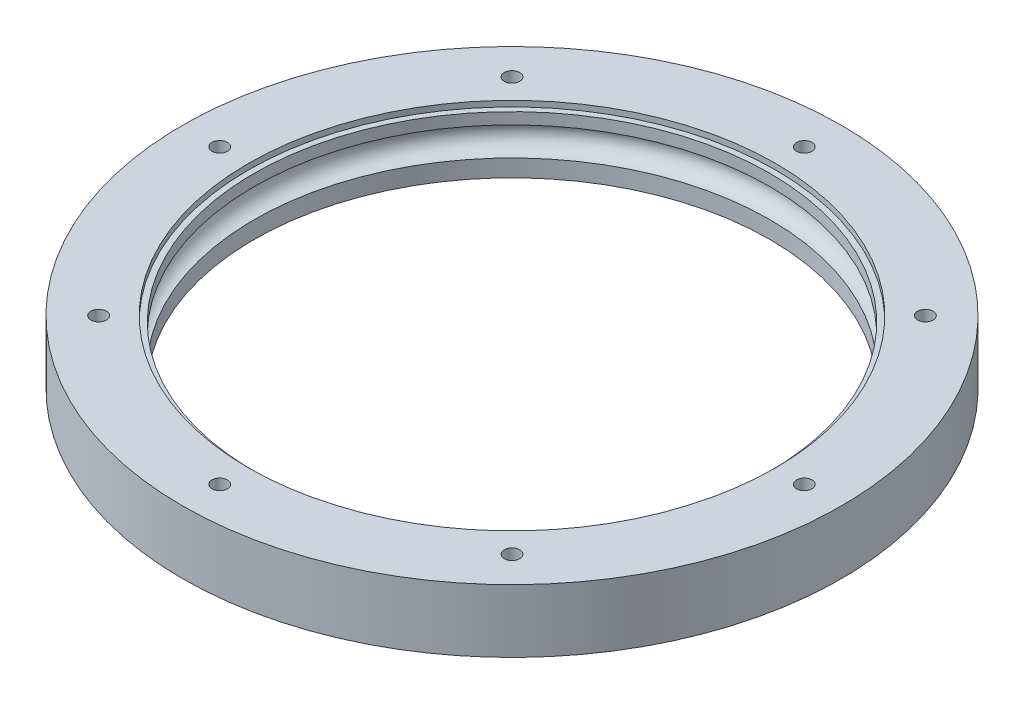
ISO-10303-21;
HEADER;
FILE_DESCRIPTION(('STEP AP214'),'2;1');
FILE_NAME('part.step','',(''),(''),'','','');
FILE_SCHEMA(('AUTOMOTIVE_DESIGN { 1 0 10303 214 1 1 1 1 }'));
ENDSEC;
DATA;
#1=APPLICATION_CONTEXT('core data for automotive mechanical design processes');
#2=APPLICATION_PROTOCOL_DEFINITION('international standard','automotive_design',2000,#1);
#3=PRODUCT_CONTEXT('',#1,'mechanical');
#4=PRODUCT('Part','Part','',(#3));
#5=PRODUCT_RELATED_PRODUCT_CATEGORY('part','',(#4));
#6=PRODUCT_DEFINITION_FORMATION('','',#4);
#7=PRODUCT_DEFINITION_CONTEXT('part definition',#1,'design');
#8=PRODUCT_DEFINITION('design','',#6,#7);
#9=PRODUCT_DEFINITION_SHAPE('','',#8);
#10=(LENGTH_UNIT() NAMED_UNIT(*) SI_UNIT(.MILLI.,.METRE.));
#11=(NAMED_UNIT(*) PLANE_ANGLE_UNIT() SI_UNIT($,.RADIAN.));
#12=(NAMED_UNIT(*) SI_UNIT($,.STERADIAN.) SOLID_ANGLE_UNIT());
#13=UNCERTAINTY_MEASURE_WITH_UNIT(LENGTH_MEASURE(1.E-05),#10,'distance_accuracy_value','');
#14=(GEOMETRIC_REPRESENTATION_CONTEXT(3) GLOBAL_UNCERTAINTY_ASSIGNED_CONTEXT((#13)) GLOBAL_UNIT_ASSIGNED_CONTEXT((#10,
#11,#12)) REPRESENTATION_CONTEXT('',''));
#15=CARTESIAN_POINT('',(0.,0.,0.));
#16=DIRECTION('',(0.,0.,1.));
#17=DIRECTION('',(1.,0.,0.));
#18=AXIS2_PLACEMENT_3D('',#15,#16,#17);
#19=CARTESIAN_POINT('',(0.,0.,0.));
#20=DIRECTION('',(0.,-1.,0.));
#21=DIRECTION('',(0.,0.,-1.));
#22=AXIS2_PLACEMENT_3D('',#19,#20,#21);
#23=CYLINDRICAL_SURFACE('',#22,57.5);
#24=CARTESIAN_POINT('',(0.,11.,0.));
#25=DIRECTION('',(0.,-1.,0.));
#26=DIRECTION('',(0.,0.,-1.));
#27=AXIS2_PLACEMENT_3D('',#24,#25,#26);
#28=CIRCLE('',#27,57.5);
#29=CARTESIAN_POINT('',(0.,11.,-57.5));
#30=VERTEX_POINT('',#29);
#31=EDGE_CURVE('E61',#30,#30,#28,.T.);
#32=ORIENTED_EDGE('',*,*,#31,.T.);
#33=EDGE_LOOP('',(#32));
#34=FACE_BOUND('',#33,.T.);
#35=CARTESIAN_POINT('',(0.,0.,0.));
#36=DIRECTION('',(0.,-1.,0.));
#37=DIRECTION('',(0.,0.,-1.));
#38=AXIS2_PLACEMENT_3D('',#35,#36,#37);
#39=CIRCLE('',#38,57.5);
#40=CARTESIAN_POINT('',(0.,0.,-57.5));
#41=VERTEX_POINT('',#40);
#42=EDGE_CURVE('E10',#41,#41,#39,.T.);
#43=ORIENTED_EDGE('',*,*,#42,.F.);
#44=EDGE_LOOP('',(#43));
#45=FACE_BOUND('',#44,.T.);
#46=ADVANCED_FACE('F33',(#34,#45),#23,.T.);
#47=CARTESIAN_POINT('',(0.,0.,0.));
#48=DIRECTION('',(0.,1.,0.));
#49=DIRECTION('',(0.,0.,1.));
#50=AXIS2_PLACEMENT_3D('',#47,#48,#49);
#51=PLANE('',#50);
#52=CARTESIAN_POINT('',(0.,0.,51.));
#53=DIRECTION('',(0.,1.,0.));
#54=DIRECTION('',(0.,0.,1.));
#55=AXIS2_PLACEMENT_3D('',#52,#53,#54);
#56=CIRCLE('',#55,1.35000000000001);
#57=CARTESIAN_POINT('',(0.,0.,52.35));
#58=VERTEX_POINT('',#57);
#59=EDGE_CURVE('E68',#58,#58,#56,.T.);
#60=ORIENTED_EDGE('',*,*,#59,.T.);
#61=EDGE_LOOP('',(#60));
#62=FACE_BOUND('',#61,.T.);
#63=CARTESIAN_POINT('',(36.0624458405139,0.,36.062445840514));
#64=DIRECTION('',(0.,1.,0.));
#65=DIRECTION('',(0.,0.,1.));
#66=AXIS2_PLACEMENT_3D('',#63,#64,#65);
#67=CIRCLE('',#66,1.35);
#68=CARTESIAN_POINT('',(36.0624458405139,0.,37.412445840514));
#69=VERTEX_POINT('',#68);
#70=EDGE_CURVE('E87',#69,#69,#67,.T.);
#71=ORIENTED_EDGE('',*,*,#70,.T.);
#72=EDGE_LOOP('',(#71));
#73=FACE_BOUND('',#72,.T.);
#74=CARTESIAN_POINT('',(51.,0.,0.));
#75=DIRECTION('',(0.,1.,0.));
#76=DIRECTION('',(0.,0.,1.));
#77=AXIS2_PLACEMENT_3D('',#74,#75,#76);
#78=CIRCLE('',#77,1.34999999999999);
#79=CARTESIAN_POINT('',(51.,0.,1.35000000000006));
#80=VERTEX_POINT('',#79);
#81=EDGE_CURVE('E81',#80,#80,#78,.T.);
#82=ORIENTED_EDGE('',*,*,#81,.T.);
#83=EDGE_LOOP('',(#82));
#84=FACE_BOUND('',#83,.T.);
#85=CARTESIAN_POINT('',(36.062445840514,0.,-36.0624458405139));
#86=DIRECTION('',(0.,1.,0.));
#87=DIRECTION('',(0.,0.,1.));
#88=AXIS2_PLACEMENT_3D('',#85,#86,#87);
#89=CIRCLE('',#88,1.35);
#90=CARTESIAN_POINT('',(36.062445840514,0.,-34.7124458405139));
#91=VERTEX_POINT('',#90);
#92=EDGE_CURVE('E74',#91,#91,#89,.T.);
#93=ORIENTED_EDGE('',*,*,#92,.T.);
#94=EDGE_LOOP('',(#93));
#95=FACE_BOUND('',#94,.T.);
#96=CARTESIAN_POINT('',(0.,0.,-51.));
#97=DIRECTION('',(0.,1.,0.));
#98=DIRECTION('',(0.,0.,1.));
#99=AXIS2_PLACEMENT_3D('',#96,#97,#98);
#100=CIRCLE('',#99,1.35);
#101=CARTESIAN_POINT('',(0.,0.,-49.65));
#102=VERTEX_POINT('',#101);
#103=EDGE_CURVE('E75',#102,#102,#100,.T.);
#104=ORIENTED_EDGE('',*,*,#103,.T.);
#105=EDGE_LOOP('',(#104));
#106=FACE_BOUND('',#105,.T.);
#107=CARTESIAN_POINT('',(-36.0624458405139,0.,-36.062445840514));
#108=DIRECTION('',(0.,1.,0.));
#109=DIRECTION('',(0.,0.,1.));
#110=AXIS2_PLACEMENT_3D('',#107,#108,#109);
#111=CIRCLE('',#110,1.35);
#112=CARTESIAN_POINT('',(-36.0624458405139,0.,-34.712445840514));
#113=VERTEX_POINT('',#112);
#114=EDGE_CURVE('E104',#113,#113,#111,.T.);
#115=ORIENTED_EDGE('',*,*,#114,.T.);
#116=EDGE_LOOP('',(#115));
#117=FACE_BOUND('',#116,.T.);
#118=CARTESIAN_POINT('',(-51.,0.,0.));
#119=DIRECTION('',(0.,1.,0.));
#120=DIRECTION('',(0.,0.,1.));
#121=AXIS2_PLACEMENT_3D('',#118,#119,#120);
#122=CIRCLE('',#121,1.35000000000001);
#123=CARTESIAN_POINT('',(-51.,0.,1.34999999999994));
#124=VERTEX_POINT('',#123);
#125=EDGE_CURVE('E98',#124,#124,#122,.T.);
#126=ORIENTED_EDGE('',*,*,#125,.T.);
#127=EDGE_LOOP('',(#126));
#128=FACE_BOUND('',#127,.T.);
#129=CARTESIAN_POINT('',(-36.062445840514,0.,36.0624458405139));
#130=DIRECTION('',(0.,1.,0.));
#131=DIRECTION('',(0.,0.,1.));
#132=AXIS2_PLACEMENT_3D('',#129,#130,#131);
#133=CIRCLE('',#132,1.35000000000001);
#134=CARTESIAN_POINT('',(-36.062445840514,0.,37.4124458405139));
#135=VERTEX_POINT('',#134);
#136=EDGE_CURVE('E64',#135,#135,#133,.T.);
#137=ORIENTED_EDGE('',*,*,#136,.T.);
#138=EDGE_LOOP('',(#137));
#139=FACE_BOUND('',#138,.T.);
#140=CARTESIAN_POINT('',(0.,0.,0.));
#141=DIRECTION('',(0.,-1.,0.));
#142=DIRECTION('',(0.,0.,-1.));
#143=AXIS2_PLACEMENT_3D('',#140,#141,#142);
#144=CIRCLE('',#143,45.);
#145=CARTESIAN_POINT('',(0.,0.,-45.));
#146=VERTEX_POINT('',#145);
#147=EDGE_CURVE('E39',#146,#146,#144,.T.);
#148=ORIENTED_EDGE('',*,*,#147,.F.);
#149=EDGE_LOOP('',(#148));
#150=FACE_BOUND('',#149,.T.);
#151=ORIENTED_EDGE('',*,*,#42,.T.);
#152=EDGE_LOOP('',(#151));
#153=FACE_BOUND('',#152,.T.);
#154=ADVANCED_FACE('F113',(#62,#73,#84,#95,#106,#117,#128,#139,#150,#153),#51,.F.);
#155=CARTESIAN_POINT('',(0.,0.,0.));
#156=DIRECTION('',(0.,-1.,0.));
#157=DIRECTION('',(0.,0.,-1.));
#158=AXIS2_PLACEMENT_3D('',#155,#156,#157);
#159=CYLINDRICAL_SURFACE('',#158,45.);
#160=ORIENTED_EDGE('',*,*,#147,.T.);
#161=EDGE_LOOP('',(#160));
#162=FACE_BOUND('',#161,.T.);
#163=CARTESIAN_POINT('',(0.,2.99999999999999,0.));
#164=DIRECTION('',(0.,-1.,0.));
#165=DIRECTION('',(0.,0.,-1.));
#166=AXIS2_PLACEMENT_3D('',#163,#164,#165);
#167=CIRCLE('',#166,45.);
#168=CARTESIAN_POINT('',(0.,2.99999999999999,-45.));
#169=VERTEX_POINT('',#168);
#170=EDGE_CURVE('E43',#169,#169,#167,.T.);
#171=ORIENTED_EDGE('',*,*,#170,.F.);
#172=EDGE_LOOP('',(#171));
#173=FACE_BOUND('',#172,.T.);
#174=ADVANCED_FACE('F146',(#162,#173),#159,.F.);
#175=CARTESIAN_POINT('',(0.,5.49999999999999,0.));
#176=DIRECTION('',(0.,-1.,0.));
#177=DIRECTION('',(0.,0.,-1.));
#178=AXIS2_PLACEMENT_3D('',#175,#176,#177);
#179=TOROIDAL_SURFACE('',#178,45.,2.5);
#180=ORIENTED_EDGE('',*,*,#170,.T.);
#181=EDGE_LOOP('',(#180));
#182=FACE_BOUND('',#181,.T.);
#183=CARTESIAN_POINT('',(0.,7.99999999999999,0.));
#184=DIRECTION('',(0.,-1.,0.));
#185=DIRECTION('',(0.,0.,-1.));
#186=AXIS2_PLACEMENT_3D('',#183,#184,#185);
#187=CIRCLE('',#186,45.);
#188=CARTESIAN_POINT('',(0.,7.99999999999999,-45.));
#189=VERTEX_POINT('',#188);
#190=EDGE_CURVE('E47',#189,#189,#187,.T.);
#191=ORIENTED_EDGE('',*,*,#190,.F.);
#192=EDGE_LOOP('',(#191));
#193=FACE_BOUND('',#192,.T.);
#194=ADVANCED_FACE('F151',(#182,#193),#179,.F.);
#195=ORIENTED_EDGE('',*,*,#190,.T.);
#196=EDGE_LOOP('',(#195));
#197=FACE_BOUND('',#196,.T.);
#198=CARTESIAN_POINT('',(0.,9.99999999999999,0.));
#199=DIRECTION('',(0.,-1.,0.));
#200=DIRECTION('',(0.,0.,-1.));
#201=AXIS2_PLACEMENT_3D('',#198,#199,#200);
#202=CIRCLE('',#201,45.);
#203=CARTESIAN_POINT('',(0.,9.99999999999999,-45.));
#204=VERTEX_POINT('',#203);
#205=EDGE_CURVE('E52',#204,#204,#202,.T.);
#206=ORIENTED_EDGE('',*,*,#205,.F.);
#207=EDGE_LOOP('',(#206));
#208=FACE_BOUND('',#207,.T.);
#209=ADVANCED_FACE('F153',(#197,#208),#159,.F.);
#210=CARTESIAN_POINT('',(0.,9.99999999999999,0.));
#211=DIRECTION('',(0.,-1.,0.));
#212=DIRECTION('',(0.,0.,-1.));
#213=AXIS2_PLACEMENT_3D('',#210,#211,#212);
#214=PLANE('',#213);
#215=CARTESIAN_POINT('',(0.,9.99999999999999,0.));
#216=DIRECTION('',(0.,-1.,0.));
#217=DIRECTION('',(0.,0.,-1.));
#218=AXIS2_PLACEMENT_3D('',#215,#216,#217);
#219=CIRCLE('',#218,46.);
#220=CARTESIAN_POINT('',(0.,9.99999999999999,-46.));
#221=VERTEX_POINT('',#220);
#222=EDGE_CURVE('E55',#221,#221,#219,.T.);
#223=ORIENTED_EDGE('',*,*,#222,.F.);
#224=EDGE_LOOP('',(#223));
#225=FACE_BOUND('',#224,.T.);
#226=ORIENTED_EDGE('',*,*,#205,.T.);
#227=EDGE_LOOP('',(#226));
#228=FACE_BOUND('',#227,.T.);
#229=ADVANCED_FACE('F160',(#225,#228),#214,.F.);
#230=CARTESIAN_POINT('',(0.,0.,0.));
#231=DIRECTION('',(0.,-1.,0.));
#232=DIRECTION('',(0.,0.,-1.));
#233=AXIS2_PLACEMENT_3D('',#230,#231,#232);
#234=CYLINDRICAL_SURFACE('',#233,46.);
#235=CARTESIAN_POINT('',(0.,11.,0.));
#236=DIRECTION('',(0.,-1.,0.));
#237=DIRECTION('',(0.,0.,-1.));
#238=AXIS2_PLACEMENT_3D('',#235,#236,#237);
#239=CIRCLE('',#238,46.);
#240=CARTESIAN_POINT('',(0.,11.,-46.));
#241=VERTEX_POINT('',#240);
#242=EDGE_CURVE('E58',#241,#241,#239,.T.);
#243=ORIENTED_EDGE('',*,*,#242,.F.);
#244=EDGE_LOOP('',(#243));
#245=FACE_BOUND('',#244,.T.);
#246=ORIENTED_EDGE('',*,*,#222,.T.);
#247=EDGE_LOOP('',(#246));
#248=FACE_BOUND('',#247,.T.);
#249=ADVANCED_FACE('F128',(#245,#248),#234,.F.);
#250=CARTESIAN_POINT('',(0.,11.,0.));
#251=DIRECTION('',(0.,1.,0.));
#252=DIRECTION('',(0.,0.,1.));
#253=AXIS2_PLACEMENT_3D('',#250,#251,#252);
#254=PLANE('',#253);
#255=CARTESIAN_POINT('',(0.,11.,51.));
#256=DIRECTION('',(0.,1.,0.));
#257=DIRECTION('',(0.,0.,1.));
#258=AXIS2_PLACEMENT_3D('',#255,#256,#257);
#259=CIRCLE('',#258,1.35000000000001);
#260=CARTESIAN_POINT('',(0.,11.,52.35));
#261=VERTEX_POINT('',#260);
#262=EDGE_CURVE('E90',#261,#261,#259,.T.);
#263=ORIENTED_EDGE('',*,*,#262,.F.);
#264=EDGE_LOOP('',(#263));
#265=FACE_BOUND('',#264,.T.);
#266=CARTESIAN_POINT('',(36.0624458405139,11.,36.062445840514));
#267=DIRECTION('',(0.,1.,0.));
#268=DIRECTION('',(0.,0.,1.));
#269=AXIS2_PLACEMENT_3D('',#266,#267,#268);
#270=CIRCLE('',#269,1.35);
#271=CARTESIAN_POINT('',(36.0624458405139,11.,37.412445840514));
#272=VERTEX_POINT('',#271);
#273=EDGE_CURVE('E84',#272,#272,#270,.T.);
#274=ORIENTED_EDGE('',*,*,#273,.F.);
#275=EDGE_LOOP('',(#274));
#276=FACE_BOUND('',#275,.T.);
#277=CARTESIAN_POINT('',(51.,11.,0.));
#278=DIRECTION('',(0.,1.,0.));
#279=DIRECTION('',(0.,0.,1.));
#280=AXIS2_PLACEMENT_3D('',#277,#278,#279);
#281=CIRCLE('',#280,1.34999999999999);
#282=CARTESIAN_POINT('',(51.,11.,1.35000000000006));
#283=VERTEX_POINT('',#282);
#284=EDGE_CURVE('E78',#283,#283,#281,.T.);
#285=ORIENTED_EDGE('',*,*,#284,.F.);
#286=EDGE_LOOP('',(#285));
#287=FACE_BOUND('',#286,.T.);
#288=CARTESIAN_POINT('',(36.062445840514,11.,-36.0624458405139));
#289=DIRECTION('',(0.,1.,0.));
#290=DIRECTION('',(0.,0.,1.));
#291=AXIS2_PLACEMENT_3D('',#288,#289,#290);
#292=CIRCLE('',#291,1.35);
#293=CARTESIAN_POINT('',(36.062445840514,11.,-34.7124458405139));
#294=VERTEX_POINT('',#293);
#295=EDGE_CURVE('E71',#294,#294,#292,.T.);
#296=ORIENTED_EDGE('',*,*,#295,.F.);
#297=EDGE_LOOP('',(#296));
#298=FACE_BOUND('',#297,.T.);
#299=CARTESIAN_POINT('',(0.,11.,-51.));
#300=DIRECTION('',(0.,1.,0.));
#301=DIRECTION('',(0.,0.,1.));
#302=AXIS2_PLACEMENT_3D('',#299,#300,#301);
#303=CIRCLE('',#302,1.35);
#304=CARTESIAN_POINT('',(0.,11.,-49.65));
#305=VERTEX_POINT('',#304);
#306=EDGE_CURVE('E107',#305,#305,#303,.T.);
#307=ORIENTED_EDGE('',*,*,#306,.F.);
#308=EDGE_LOOP('',(#307));
#309=FACE_BOUND('',#308,.T.);
#310=CARTESIAN_POINT('',(-36.0624458405139,11.,-36.062445840514));
#311=DIRECTION('',(0.,1.,0.));
#312=DIRECTION('',(0.,0.,1.));
#313=AXIS2_PLACEMENT_3D('',#310,#311,#312);
#314=CIRCLE('',#313,1.35);
#315=CARTESIAN_POINT('',(-36.0624458405139,11.,-34.712445840514));
#316=VERTEX_POINT('',#315);
#317=EDGE_CURVE('E101',#316,#316,#314,.T.);
#318=ORIENTED_EDGE('',*,*,#317,.F.);
#319=EDGE_LOOP('',(#318));
#320=FACE_BOUND('',#319,.T.);
#321=CARTESIAN_POINT('',(-51.,11.,0.));
#322=DIRECTION('',(0.,1.,0.));
#323=DIRECTION('',(0.,0.,1.));
#324=AXIS2_PLACEMENT_3D('',#321,#322,#323);
#325=CIRCLE('',#324,1.35000000000001);
#326=CARTESIAN_POINT('',(-51.,11.,1.34999999999994));
#327=VERTEX_POINT('',#326);
#328=EDGE_CURVE('E95',#327,#327,#325,.T.);
#329=ORIENTED_EDGE('',*,*,#328,.F.);
#330=EDGE_LOOP('',(#329));
#331=FACE_BOUND('',#330,.T.);
#332=CARTESIAN_POINT('',(-36.062445840514,11.,36.0624458405139));
#333=DIRECTION('',(0.,1.,0.));
#334=DIRECTION('',(0.,0.,1.));
#335=AXIS2_PLACEMENT_3D('',#332,#333,#334);
#336=CIRCLE('',#335,1.35000000000001);
#337=CARTESIAN_POINT('',(-36.062445840514,11.,37.4124458405139));
#338=VERTEX_POINT('',#337);
#339=EDGE_CURVE('E65',#338,#338,#336,.T.);
#340=ORIENTED_EDGE('',*,*,#339,.F.);
#341=EDGE_LOOP('',(#340));
#342=FACE_BOUND('',#341,.T.);
#343=ORIENTED_EDGE('',*,*,#242,.T.);
#344=EDGE_LOOP('',(#343));
#345=FACE_BOUND('',#344,.T.);
#346=ORIENTED_EDGE('',*,*,#31,.F.);
#347=EDGE_LOOP('',(#346));
#348=FACE_BOUND('',#347,.T.);
#349=ADVANCED_FACE('F124',(#265,#276,#287,#298,#309,#320,#331,#342,#345,#348),#254,.T.);
#350=CARTESIAN_POINT('',(-36.062445840514,0.,36.0624458405139));
#351=DIRECTION('',(0.,1.,0.));
#352=DIRECTION('',(0.,0.,1.));
#353=AXIS2_PLACEMENT_3D('',#350,#351,#352);
#354=CYLINDRICAL_SURFACE('',#353,1.35000000000001);
#355=ORIENTED_EDGE('',*,*,#136,.F.);
#356=EDGE_LOOP('',(#355));
#357=FACE_BOUND('',#356,.T.);
#358=ORIENTED_EDGE('',*,*,#339,.T.);
#359=EDGE_LOOP('',(#358));
#360=FACE_BOUND('',#359,.T.);
#361=ADVANCED_FACE('F127',(#357,#360),#354,.F.);
#362=CARTESIAN_POINT('',(-51.,0.,0.));
#363=DIRECTION('',(0.,1.,0.));
#364=DIRECTION('',(0.,0.,1.));
#365=AXIS2_PLACEMENT_3D('',#362,#363,#364);
#366=CYLINDRICAL_SURFACE('',#365,1.35000000000001);
#367=ORIENTED_EDGE('',*,*,#125,.F.);
#368=EDGE_LOOP('',(#367));
#369=FACE_BOUND('',#368,.T.);
#370=ORIENTED_EDGE('',*,*,#328,.T.);
#371=EDGE_LOOP('',(#370));
#372=FACE_BOUND('',#371,.T.);
#373=ADVANCED_FACE('F170',(#369,#372),#366,.F.);
#374=CARTESIAN_POINT('',(-36.0624458405139,0.,-36.062445840514));
#375=DIRECTION('',(0.,1.,0.));
#376=DIRECTION('',(0.,0.,1.));
#377=AXIS2_PLACEMENT_3D('',#374,#375,#376);
#378=CYLINDRICAL_SURFACE('',#377,1.35);
#379=ORIENTED_EDGE('',*,*,#114,.F.);
#380=EDGE_LOOP('',(#379));
#381=FACE_BOUND('',#380,.T.);
#382=ORIENTED_EDGE('',*,*,#317,.T.);
#383=EDGE_LOOP('',(#382));
#384=FACE_BOUND('',#383,.T.);
#385=ADVANCED_FACE('F120',(#381,#384),#378,.F.);
#386=CARTESIAN_POINT('',(0.,0.,-51.));
#387=DIRECTION('',(0.,1.,0.));
#388=DIRECTION('',(0.,0.,1.));
#389=AXIS2_PLACEMENT_3D('',#386,#387,#388);
#390=CYLINDRICAL_SURFACE('',#389,1.35);
#391=ORIENTED_EDGE('',*,*,#103,.F.);
#392=EDGE_LOOP('',(#391));
#393=FACE_BOUND('',#392,.T.);
#394=ORIENTED_EDGE('',*,*,#306,.T.);
#395=EDGE_LOOP('',(#394));
#396=FACE_BOUND('',#395,.T.);
#397=ADVANCED_FACE('F116',(#393,#396),#390,.F.);
#398=CARTESIAN_POINT('',(36.062445840514,0.,-36.0624458405139));
#399=DIRECTION('',(0.,1.,0.));
#400=DIRECTION('',(0.,0.,1.));
#401=AXIS2_PLACEMENT_3D('',#398,#399,#400);
#402=CYLINDRICAL_SURFACE('',#401,1.35);
#403=ORIENTED_EDGE('',*,*,#92,.F.);
#404=EDGE_LOOP('',(#403));
#405=FACE_BOUND('',#404,.T.);
#406=ORIENTED_EDGE('',*,*,#295,.T.);
#407=EDGE_LOOP('',(#406));
#408=FACE_BOUND('',#407,.T.);
#409=ADVANCED_FACE('F119',(#405,#408),#402,.F.);
#410=CARTESIAN_POINT('',(51.,0.,0.));
#411=DIRECTION('',(0.,1.,0.));
#412=DIRECTION('',(0.,0.,1.));
#413=AXIS2_PLACEMENT_3D('',#410,#411,#412);
#414=CYLINDRICAL_SURFACE('',#413,1.34999999999999);
#415=ORIENTED_EDGE('',*,*,#81,.F.);
#416=EDGE_LOOP('',(#415));
#417=FACE_BOUND('',#416,.T.);
#418=ORIENTED_EDGE('',*,*,#284,.T.);
#419=EDGE_LOOP('',(#418));
#420=FACE_BOUND('',#419,.T.);
#421=ADVANCED_FACE('F174',(#417,#420),#414,.F.);
#422=CARTESIAN_POINT('',(36.0624458405139,0.,36.062445840514));
#423=DIRECTION('',(0.,1.,0.));
#424=DIRECTION('',(0.,0.,1.));
#425=AXIS2_PLACEMENT_3D('',#422,#423,#424);
#426=CYLINDRICAL_SURFACE('',#425,1.35);
#427=ORIENTED_EDGE('',*,*,#70,.F.);
#428=EDGE_LOOP('',(#427));
#429=FACE_BOUND('',#428,.T.);
#430=ORIENTED_EDGE('',*,*,#273,.T.);
#431=EDGE_LOOP('',(#430));
#432=FACE_BOUND('',#431,.T.);
#433=ADVANCED_FACE('F178',(#429,#432),#426,.F.);
#434=CARTESIAN_POINT('',(0.,0.,51.));
#435=DIRECTION('',(0.,1.,0.));
#436=DIRECTION('',(0.,0.,1.));
#437=AXIS2_PLACEMENT_3D('',#434,#435,#436);
#438=CYLINDRICAL_SURFACE('',#437,1.35000000000001);
#439=ORIENTED_EDGE('',*,*,#59,.F.);
#440=EDGE_LOOP('',(#439));
#441=FACE_BOUND('',#440,.T.);
#442=ORIENTED_EDGE('',*,*,#262,.T.);
#443=EDGE_LOOP('',(#442));
#444=FACE_BOUND('',#443,.T.);
#445=ADVANCED_FACE('F182',(#441,#444),#438,.F.);
#446=CLOSED_SHELL('',(#46,#154,#174,#194,#209,#229,#249,#349,#361,#373,#385,#397,#409,#421,#433,#445));
#447=MANIFOLD_SOLID_BREP('B2',#446);
#448=ADVANCED_BREP_SHAPE_REPRESENTATION('',(#18,#447),#14);
#449=SHAPE_DEFINITION_REPRESENTATION(#9,#448);
ENDSEC;
END-ISO-10303-21;
